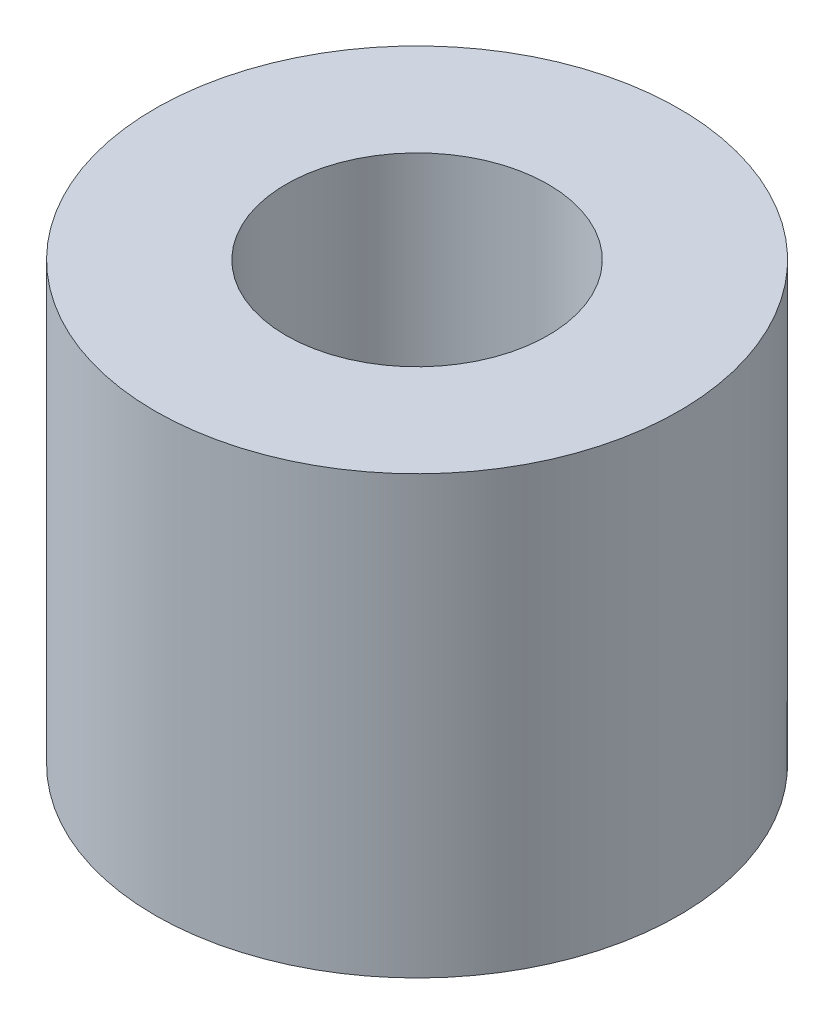
ISO-10303-21;
HEADER;
FILE_DESCRIPTION(('STEP AP214'),'2;1');
FILE_NAME('part.step','',(''),(''),'','','');
FILE_SCHEMA(('AUTOMOTIVE_DESIGN { 1 0 10303 214 1 1 1 1 }'));
ENDSEC;
DATA;
#1=APPLICATION_CONTEXT('core data for automotive mechanical design processes');
#2=APPLICATION_PROTOCOL_DEFINITION('international standard','automotive_design',2000,#1);
#3=PRODUCT_CONTEXT('',#1,'mechanical');
#4=PRODUCT('Part','Part','',(#3));
#5=PRODUCT_RELATED_PRODUCT_CATEGORY('part','',(#4));
#6=PRODUCT_DEFINITION_FORMATION('','',#4);
#7=PRODUCT_DEFINITION_CONTEXT('part definition',#1,'design');
#8=PRODUCT_DEFINITION('design','',#6,#7);
#9=PRODUCT_DEFINITION_SHAPE('','',#8);
#10=(LENGTH_UNIT() NAMED_UNIT(*) SI_UNIT(.MILLI.,.METRE.));
#11=(NAMED_UNIT(*) PLANE_ANGLE_UNIT() SI_UNIT($,.RADIAN.));
#12=(NAMED_UNIT(*) SI_UNIT($,.STERADIAN.) SOLID_ANGLE_UNIT());
#13=UNCERTAINTY_MEASURE_WITH_UNIT(LENGTH_MEASURE(1.E-05),#10,'distance_accuracy_value','');
#14=(GEOMETRIC_REPRESENTATION_CONTEXT(3) GLOBAL_UNCERTAINTY_ASSIGNED_CONTEXT((#13)) GLOBAL_UNIT_ASSIGNED_CONTEXT((#10,
#11,#12)) REPRESENTATION_CONTEXT('',''));
#15=CARTESIAN_POINT('',(0.,0.,0.));
#16=DIRECTION('',(0.,0.,1.));
#17=DIRECTION('',(1.,0.,0.));
#18=AXIS2_PLACEMENT_3D('',#15,#16,#17);
#19=CARTESIAN_POINT('',(0.,5.,0.));
#20=DIRECTION('',(0.,1.,0.));
#21=DIRECTION('',(0.,0.,1.));
#22=AXIS2_PLACEMENT_3D('',#19,#20,#21);
#23=PLANE('',#22);
#24=CARTESIAN_POINT('',(0.,5.,0.));
#25=DIRECTION('',(0.,1.,0.));
#26=DIRECTION('',(0.,0.,1.));
#27=AXIS2_PLACEMENT_3D('',#24,#25,#26);
#28=CIRCLE('',#27,3.);
#29=CARTESIAN_POINT('',(0.,5.,3.));
#30=VERTEX_POINT('',#29);
#31=EDGE_CURVE('E10',#30,#30,#28,.T.);
#32=ORIENTED_EDGE('',*,*,#31,.T.);
#33=EDGE_LOOP('',(#32));
#34=FACE_BOUND('',#33,.T.);
#35=CARTESIAN_POINT('',(0.,5.,0.));
#36=DIRECTION('',(0.,1.,0.));
#37=DIRECTION('',(0.,0.,1.));
#38=AXIS2_PLACEMENT_3D('',#35,#36,#37);
#39=CIRCLE('',#38,1.5);
#40=CARTESIAN_POINT('',(0.,5.,1.5));
#41=VERTEX_POINT('',#40);
#42=EDGE_CURVE('E50',#41,#41,#39,.T.);
#43=ORIENTED_EDGE('',*,*,#42,.F.);
#44=EDGE_LOOP('',(#43));
#45=FACE_BOUND('',#44,.T.);
#46=ADVANCED_FACE('F37',(#34,#45),#23,.T.);
#47=CARTESIAN_POINT('',(0.,0.,0.));
#48=DIRECTION('',(0.,1.,0.));
#49=DIRECTION('',(0.,0.,1.));
#50=AXIS2_PLACEMENT_3D('',#47,#48,#49);
#51=PLANE('',#50);
#52=CARTESIAN_POINT('',(0.,0.,0.));
#53=DIRECTION('',(0.,1.,0.));
#54=DIRECTION('',(0.,0.,1.));
#55=AXIS2_PLACEMENT_3D('',#52,#53,#54);
#56=CIRCLE('',#55,3.);
#57=CARTESIAN_POINT('',(0.,0.,3.));
#58=VERTEX_POINT('',#57);
#59=EDGE_CURVE('E41',#58,#58,#56,.T.);
#60=ORIENTED_EDGE('',*,*,#59,.F.);
#61=EDGE_LOOP('',(#60));
#62=FACE_BOUND('',#61,.T.);
#63=CARTESIAN_POINT('',(0.,0.,0.));
#64=DIRECTION('',(0.,1.,0.));
#65=DIRECTION('',(0.,0.,1.));
#66=AXIS2_PLACEMENT_3D('',#63,#64,#65);
#67=CIRCLE('',#66,1.5);
#68=CARTESIAN_POINT('',(0.,0.,1.5));
#69=VERTEX_POINT('',#68);
#70=EDGE_CURVE('E52',#69,#69,#67,.T.);
#71=ORIENTED_EDGE('',*,*,#70,.T.);
#72=EDGE_LOOP('',(#71));
#73=FACE_BOUND('',#72,.T.);
#74=ADVANCED_FACE('F64',(#62,#73),#51,.F.);
#75=CARTESIAN_POINT('',(0.,5.,0.));
#76=DIRECTION('',(0.,-1.,0.));
#77=DIRECTION('',(0.,0.,-1.));
#78=AXIS2_PLACEMENT_3D('',#75,#76,#77);
#79=CYLINDRICAL_SURFACE('',#78,3.);
#80=ORIENTED_EDGE('',*,*,#31,.F.);
#81=EDGE_LOOP('',(#80));
#82=FACE_BOUND('',#81,.T.);
#83=ORIENTED_EDGE('',*,*,#59,.T.);
#84=EDGE_LOOP('',(#83));
#85=FACE_BOUND('',#84,.T.);
#86=ADVANCED_FACE('F39',(#82,#85),#79,.T.);
#87=CARTESIAN_POINT('',(0.,5.,0.));
#88=DIRECTION('',(0.,-1.,0.));
#89=DIRECTION('',(0.,0.,-1.));
#90=AXIS2_PLACEMENT_3D('',#87,#88,#89);
#91=CYLINDRICAL_SURFACE('',#90,1.5);
#92=ORIENTED_EDGE('',*,*,#42,.T.);
#93=EDGE_LOOP('',(#92));
#94=FACE_BOUND('',#93,.T.);
#95=ORIENTED_EDGE('',*,*,#70,.F.);
#96=EDGE_LOOP('',(#95));
#97=FACE_BOUND('',#96,.T.);
#98=ADVANCED_FACE('F60',(#94,#97),#91,.F.);
#99=CLOSED_SHELL('',(#46,#74,#86,#98));
#100=MANIFOLD_SOLID_BREP('B2',#99);
#101=ADVANCED_BREP_SHAPE_REPRESENTATION('',(#18,#100),#14);
#102=SHAPE_DEFINITION_REPRESENTATION(#9,#101);
ENDSEC;
END-ISO-10303-21;
